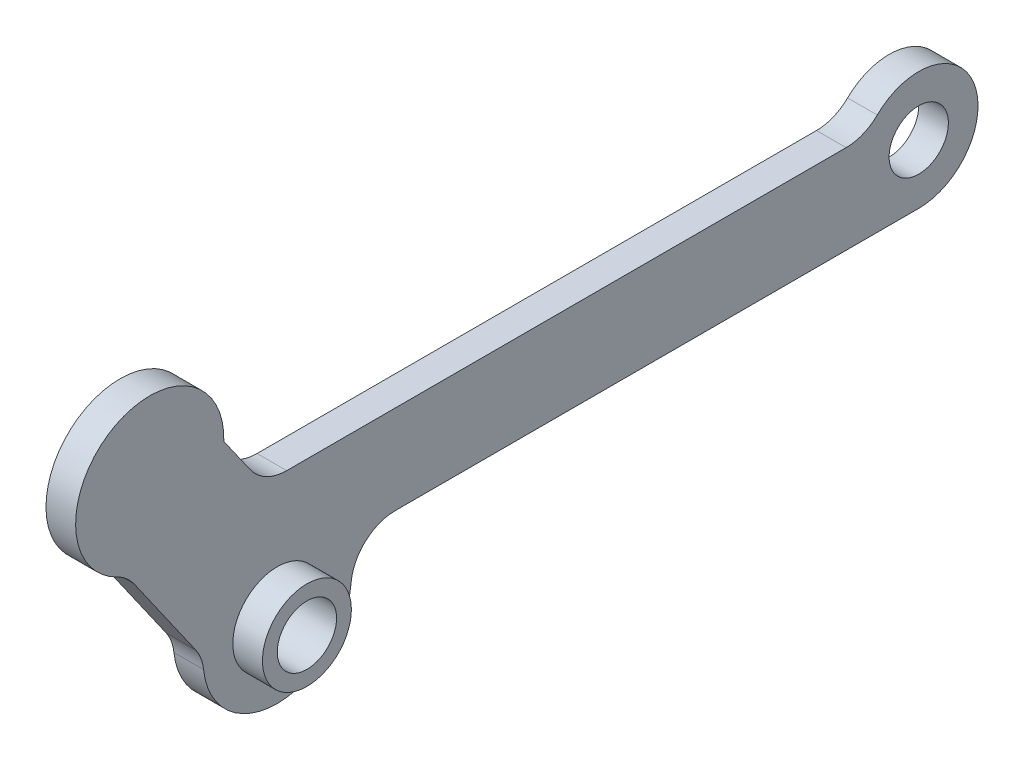
ISO-10303-21;
HEADER;
FILE_DESCRIPTION(('STEP AP214'),'2;1');
FILE_NAME('part.step','',(''),(''),'','','');
FILE_SCHEMA(('AUTOMOTIVE_DESIGN { 1 0 10303 214 1 1 1 1 }'));
ENDSEC;
DATA;
#1=APPLICATION_CONTEXT('core data for automotive mechanical design processes');
#2=APPLICATION_PROTOCOL_DEFINITION('international standard','automotive_design',2000,#1);
#3=PRODUCT_CONTEXT('',#1,'mechanical');
#4=PRODUCT('Part','Part','',(#3));
#5=PRODUCT_RELATED_PRODUCT_CATEGORY('part','',(#4));
#6=PRODUCT_DEFINITION_FORMATION('','',#4);
#7=PRODUCT_DEFINITION_CONTEXT('part definition',#1,'design');
#8=PRODUCT_DEFINITION('design','',#6,#7);
#9=PRODUCT_DEFINITION_SHAPE('','',#8);
#10=(LENGTH_UNIT() NAMED_UNIT(*) SI_UNIT(.MILLI.,.METRE.));
#11=(NAMED_UNIT(*) PLANE_ANGLE_UNIT() SI_UNIT($,.RADIAN.));
#12=(NAMED_UNIT(*) SI_UNIT($,.STERADIAN.) SOLID_ANGLE_UNIT());
#13=UNCERTAINTY_MEASURE_WITH_UNIT(LENGTH_MEASURE(1.E-05),#10,'distance_accuracy_value','');
#14=(GEOMETRIC_REPRESENTATION_CONTEXT(3) GLOBAL_UNCERTAINTY_ASSIGNED_CONTEXT((#13)) GLOBAL_UNIT_ASSIGNED_CONTEXT((#10,
#11,#12)) REPRESENTATION_CONTEXT('',''));
#15=CARTESIAN_POINT('',(0.,0.,0.));
#16=DIRECTION('',(0.,0.,1.));
#17=DIRECTION('',(1.,0.,0.));
#18=AXIS2_PLACEMENT_3D('',#15,#16,#17);
#19=CARTESIAN_POINT('',(2.,0.,0.));
#20=DIRECTION('',(0.,1.,0.));
#21=DIRECTION('',(0.,0.,1.));
#22=AXIS2_PLACEMENT_3D('',#19,#20,#21);
#23=PLANE('',#22);
#24=DIRECTION('',(0.,0.,-1.));
#25=VECTOR('',#24,1.);
#26=CARTESIAN_POINT('',(2.,0.,0.));
#27=LINE('',#26,#25);
#28=CARTESIAN_POINT('',(2.,0.,-1.56170115165524));
#29=VERTEX_POINT('',#28);
#30=CARTESIAN_POINT('',(2.,0.,-39.3022657436919));
#31=VERTEX_POINT('',#30);
#32=EDGE_CURVE('E239',#29,#31,#27,.T.);
#33=ORIENTED_EDGE('',*,*,#32,.T.);
#34=DIRECTION('',(-1.,0.,0.));
#35=VECTOR('',#34,1.);
#36=CARTESIAN_POINT('',(2.,0.,-39.3022657436919));
#37=LINE('',#36,#35);
#38=CARTESIAN_POINT('',(0.,0.,-39.3022657436919));
#39=VERTEX_POINT('',#38);
#40=EDGE_CURVE('E273',#31,#39,#37,.T.);
#41=ORIENTED_EDGE('',*,*,#40,.T.);
#42=DIRECTION('',(0.,0.,-1.));
#43=VECTOR('',#42,1.);
#44=CARTESIAN_POINT('',(0.,0.,0.));
#45=LINE('',#44,#43);
#46=CARTESIAN_POINT('',(0.,0.,-1.56170115165524));
#47=VERTEX_POINT('',#46);
#48=EDGE_CURVE('E265',#47,#39,#45,.T.);
#49=ORIENTED_EDGE('',*,*,#48,.F.);
#50=DIRECTION('',(-1.,0.,0.));
#51=VECTOR('',#50,1.);
#52=CARTESIAN_POINT('',(2.,0.,-1.56170115165524));
#53=LINE('',#52,#51);
#54=EDGE_CURVE('E248',#47,#29,#53,.F.);
#55=ORIENTED_EDGE('',*,*,#54,.T.);
#56=EDGE_LOOP('',(#33,#41,#49,#55));
#57=FACE_BOUND('',#56,.T.);
#58=ADVANCED_FACE('F136',(#57),#23,.T.);
#59=CARTESIAN_POINT('',(2.,-6.,0.));
#60=DIRECTION('',(0.,1.,0.));
#61=DIRECTION('',(0.,0.,1.));
#62=AXIS2_PLACEMENT_3D('',#59,#60,#61);
#63=PLANE('',#62);
#64=DIRECTION('',(0.,0.,-1.));
#65=VECTOR('',#64,1.);
#66=CARTESIAN_POINT('',(2.,-6.,0.));
#67=LINE('',#66,#65);
#68=CARTESIAN_POINT('',(2.,-6.,-8.89345099264765));
#69=VERTEX_POINT('',#68);
#70=CARTESIAN_POINT('',(2.,-6.,-44.2012452292583));
#71=VERTEX_POINT('',#70);
#72=EDGE_CURVE('E226',#69,#71,#67,.T.);
#73=ORIENTED_EDGE('',*,*,#72,.F.);
#74=DIRECTION('',(1.,0.,0.));
#75=VECTOR('',#74,1.);
#76=CARTESIAN_POINT('',(0.,-6.,-8.89345099264765));
#77=LINE('',#76,#75);
#78=CARTESIAN_POINT('',(0.,-6.,-8.89345099264765));
#79=VERTEX_POINT('',#78);
#80=EDGE_CURVE('E289',#69,#79,#77,.F.);
#81=ORIENTED_EDGE('',*,*,#80,.T.);
#82=DIRECTION('',(0.,0.,-1.));
#83=VECTOR('',#82,1.);
#84=CARTESIAN_POINT('',(0.,-6.,0.));
#85=LINE('',#84,#83);
#86=CARTESIAN_POINT('',(0.,-6.,-44.2012452292583));
#87=VERTEX_POINT('',#86);
#88=EDGE_CURVE('E244',#79,#87,#85,.T.);
#89=ORIENTED_EDGE('',*,*,#88,.T.);
#90=DIRECTION('',(-1.,0.,0.));
#91=VECTOR('',#90,1.);
#92=CARTESIAN_POINT('',(2.,-6.,-44.2012452292583));
#93=LINE('',#92,#91);
#94=EDGE_CURVE('E238',#71,#87,#93,.T.);
#95=ORIENTED_EDGE('',*,*,#94,.F.);
#96=EDGE_LOOP('',(#73,#81,#89,#95));
#97=FACE_BOUND('',#96,.T.);
#98=ADVANCED_FACE('F242',(#97),#63,.F.);
#99=CARTESIAN_POINT('',(0.,0.,0.));
#100=DIRECTION('',(1.,0.,0.));
#101=DIRECTION('',(0.,0.,-1.));
#102=AXIS2_PLACEMENT_3D('',#99,#100,#101);
#103=PLANE('',#102);
#104=CARTESIAN_POINT('',(0.,3.99297491893065,7.67900949316339));
#105=DIRECTION('',(1.,0.,0.));
#106=DIRECTION('',(0.,0.,-1.));
#107=AXIS2_PLACEMENT_3D('',#104,#105,#106);
#108=CIRCLE('',#107,1.8);
#109=CARTESIAN_POINT('',(0.,3.99297491893065,5.87900949316339));
#110=VERTEX_POINT('',#109);
#111=EDGE_CURVE('E12',#110,#110,#108,.F.);
#112=ORIENTED_EDGE('',*,*,#111,.F.);
#113=EDGE_LOOP('',(#112));
#114=FACE_BOUND('',#113,.T.);
#115=CARTESIAN_POINT('',(0.,-8.29430574540418,-0.924637052102279));
#116=DIRECTION('',(1.,0.,0.));
#117=DIRECTION('',(0.,0.,-1.));
#118=AXIS2_PLACEMENT_3D('',#115,#116,#117);
#119=CIRCLE('',#118,2.);
#120=CARTESIAN_POINT('',(0.,-8.29430574540418,-2.92463705210228));
#121=VERTEX_POINT('',#120);
#122=EDGE_CURVE('E271',#121,#121,#119,.F.);
#123=ORIENTED_EDGE('',*,*,#122,.F.);
#124=EDGE_LOOP('',(#123));
#125=FACE_BOUND('',#124,.T.);
#126=CARTESIAN_POINT('',(0.,-2.,-44.2012452292583));
#127=DIRECTION('',(1.,0.,0.));
#128=DIRECTION('',(0.,0.,-1.));
#129=AXIS2_PLACEMENT_3D('',#126,#127,#128);
#130=CIRCLE('',#129,2.);
#131=CARTESIAN_POINT('',(0.,-2.,-46.2012452292583));
#132=VERTEX_POINT('',#131);
#133=EDGE_CURVE('E270',#132,#132,#130,.F.);
#134=ORIENTED_EDGE('',*,*,#133,.F.);
#135=EDGE_LOOP('',(#134));
#136=FACE_BOUND('',#135,.T.);
#137=DIRECTION('',(0.,-0.819152044288992,-0.573576436351045));
#138=VECTOR('',#137,1.);
#139=CARTESIAN_POINT('',(0.,6.28728066433489,4.40240131600742));
#140=LINE('',#139,#138);
#141=CARTESIAN_POINT('',(0.,3.82982453146792,2.6816720069543));
#142=VERTEX_POINT('',#141);
#143=CARTESIAN_POINT('',(0.,1.27927069094687,0.895754981211733));
#144=VERTEX_POINT('',#143);
#145=EDGE_CURVE('E315',#142,#144,#140,.T.);
#146=ORIENTED_EDGE('',*,*,#145,.T.);
#147=CARTESIAN_POINT('',(0.,3.,-1.56170115165524));
#148=DIRECTION('',(1.,0.,0.));
#149=DIRECTION('',(0.,0.,-1.));
#150=AXIS2_PLACEMENT_3D('',#147,#148,#149);
#151=CIRCLE('',#150,3.);
#152=EDGE_CURVE('E151',#144,#47,#151,.T.);
#153=ORIENTED_EDGE('',*,*,#152,.T.);
#154=ORIENTED_EDGE('',*,*,#48,.T.);
#155=CARTESIAN_POINT('',(0.,3.,-39.3022657436919));
#156=DIRECTION('',(1.,0.,0.));
#157=DIRECTION('',(0.,0.,-1.));
#158=AXIS2_PLACEMENT_3D('',#155,#156,#157);
#159=CIRCLE('',#158,3.);
#160=CARTESIAN_POINT('',(0.,0.857142857142855,-41.4018283803632));
#161=VERTEX_POINT('',#160);
#162=EDGE_CURVE('E293',#39,#161,#159,.T.);
#163=ORIENTED_EDGE('',*,*,#162,.T.);
#164=CARTESIAN_POINT('',(0.,-2.,-44.2012452292583));
#165=DIRECTION('',(1.,0.,0.));
#166=DIRECTION('',(0.,0.,-1.));
#167=AXIS2_PLACEMENT_3D('',#164,#165,#166);
#168=CIRCLE('',#167,3.99999999999999);
#169=EDGE_CURVE('E254',#87,#161,#168,.T.);
#170=ORIENTED_EDGE('',*,*,#169,.F.);
#171=ORIENTED_EDGE('',*,*,#88,.F.);
#172=CARTESIAN_POINT('',(0.,-9.,-8.89345099264765));
#173=DIRECTION('',(1.,0.,0.));
#174=DIRECTION('',(0.,0.,-1.));
#175=AXIS2_PLACEMENT_3D('',#172,#173,#174);
#176=CIRCLE('',#175,3.);
#177=CARTESIAN_POINT('',(0.,-8.73536465452657,-5.90514576494314));
#178=VERTEX_POINT('',#177);
#179=EDGE_CURVE('E305',#79,#178,#176,.T.);
#180=ORIENTED_EDGE('',*,*,#179,.T.);
#181=CARTESIAN_POINT('',(0.,-8.29430574540418,-0.924637052102279));
#182=DIRECTION('',(1.,0.,0.));
#183=DIRECTION('',(0.,0.,-1.));
#184=AXIS2_PLACEMENT_3D('',#181,#182,#183);
#185=CIRCLE('',#184,4.99999999999999);
#186=CARTESIAN_POINT('',(0.,-8.82085126347562,4.04756063276493));
#187=VERTEX_POINT('',#186);
#188=EDGE_CURVE('E253',#187,#178,#185,.T.);
#189=ORIENTED_EDGE('',*,*,#188,.F.);
#190=CARTESIAN_POINT('',(0.,-9.13677857431849,7.03087924368525));
#191=DIRECTION('',(1.,0.,0.));
#192=DIRECTION('',(0.,0.,-1.));
#193=AXIS2_PLACEMENT_3D('',#190,#191,#192);
#194=CIRCLE('',#193,3.);
#195=CARTESIAN_POINT('',(0.,-7.41604926526535,4.57342311081828));
#196=VERTEX_POINT('',#195);
#197=EDGE_CURVE('E297',#187,#196,#194,.T.);
#198=ORIENTED_EDGE('',*,*,#197,.T.);
#199=DIRECTION('',(0.,-0.819152044288993,-0.573576436351045));
#200=VECTOR('',#199,1.);
#201=CARTESIAN_POINT('',(0.,1.69866917352653,10.9556176703194));
#202=LINE('',#201,#200);
#203=CARTESIAN_POINT('',(0.,-1.47389305201649,8.73416568455478));
#204=VERTEX_POINT('',#203);
#205=EDGE_CURVE('E326',#204,#196,#202,.T.);
#206=ORIENTED_EDGE('',*,*,#205,.F.);
#207=CARTESIAN_POINT('',(0.,-3.19462236106962,11.1916218174218));
#208=DIRECTION('',(1.,0.,0.));
#209=DIRECTION('',(0.,0.,-1.));
#210=AXIS2_PLACEMENT_3D('',#207,#208,#209);
#211=CIRCLE('',#210,3.);
#212=CARTESIAN_POINT('',(0.,-0.499273381069496,9.87439219582487));
#213=VERTEX_POINT('',#212);
#214=EDGE_CURVE('E301',#204,#213,#211,.T.);
#215=ORIENTED_EDGE('',*,*,#214,.T.);
#216=CARTESIAN_POINT('',(0.,3.99297491893071,7.67900949316339));
#217=DIRECTION('',(1.,0.,0.));
#218=DIRECTION('',(0.,0.,-1.));
#219=AXIS2_PLACEMENT_3D('',#216,#217,#218);
#220=CIRCLE('',#219,4.99999999999999);
#221=EDGE_CURVE('E329',#142,#213,#220,.T.);
#222=ORIENTED_EDGE('',*,*,#221,.F.);
#223=EDGE_LOOP('',(#146,#153,#154,#163,#170,#171,#180,#189,#198,#206,#215,#222));
#224=FACE_BOUND('',#223,.T.);
#225=ADVANCED_FACE('F312',(#114,#125,#136,#224),#103,.F.);
#226=CARTESIAN_POINT('',(2.,0.,0.));
#227=DIRECTION('',(1.,0.,0.));
#228=DIRECTION('',(0.,0.,-1.));
#229=AXIS2_PLACEMENT_3D('',#226,#227,#228);
#230=PLANE('',#229);
#231=CARTESIAN_POINT('',(2.,-2.,-44.2012452292583));
#232=DIRECTION('',(1.,0.,0.));
#233=DIRECTION('',(0.,0.,-1.));
#234=AXIS2_PLACEMENT_3D('',#231,#232,#233);
#235=CIRCLE('',#234,2.);
#236=CARTESIAN_POINT('',(2.,-2.,-46.2012452292583));
#237=VERTEX_POINT('',#236);
#238=EDGE_CURVE('E267',#237,#237,#235,.F.);
#239=ORIENTED_EDGE('',*,*,#238,.T.);
#240=EDGE_LOOP('',(#239));
#241=FACE_BOUND('',#240,.T.);
#242=CARTESIAN_POINT('',(2.,-8.29430574540418,-0.924637052102279));
#243=DIRECTION('',(1.,0.,0.));
#244=DIRECTION('',(0.,0.,-1.));
#245=AXIS2_PLACEMENT_3D('',#242,#243,#244);
#246=CIRCLE('',#245,3.);
#247=CARTESIAN_POINT('',(2.,-8.29430574540418,-3.92463705210228));
#248=VERTEX_POINT('',#247);
#249=EDGE_CURVE('E503',#248,#248,#246,.T.);
#250=ORIENTED_EDGE('',*,*,#249,.F.);
#251=EDGE_LOOP('',(#250));
#252=FACE_BOUND('',#251,.T.);
#253=CARTESIAN_POINT('',(2.,-8.29430574540418,-0.924637052102279));
#254=DIRECTION('',(1.,0.,0.));
#255=DIRECTION('',(0.,0.,-1.));
#256=AXIS2_PLACEMENT_3D('',#253,#254,#255);
#257=CIRCLE('',#256,4.99999999999999);
#258=CARTESIAN_POINT('',(2.,-8.82085126347562,4.04756063276493));
#259=VERTEX_POINT('',#258);
#260=CARTESIAN_POINT('',(2.,-8.73536465452657,-5.90514576494314));
#261=VERTEX_POINT('',#260);
#262=EDGE_CURVE('E257',#259,#261,#257,.T.);
#263=ORIENTED_EDGE('',*,*,#262,.T.);
#264=CARTESIAN_POINT('',(2.,-9.,-8.89345099264765));
#265=DIRECTION('',(1.,0.,0.));
#266=DIRECTION('',(0.,0.,-1.));
#267=AXIS2_PLACEMENT_3D('',#264,#265,#266);
#268=CIRCLE('',#267,3.);
#269=EDGE_CURVE('E234',#261,#69,#268,.F.);
#270=ORIENTED_EDGE('',*,*,#269,.T.);
#271=ORIENTED_EDGE('',*,*,#72,.T.);
#272=CARTESIAN_POINT('',(2.,-2.,-44.2012452292583));
#273=DIRECTION('',(1.,0.,0.));
#274=DIRECTION('',(0.,0.,-1.));
#275=AXIS2_PLACEMENT_3D('',#272,#273,#274);
#276=CIRCLE('',#275,3.99999999999999);
#277=CARTESIAN_POINT('',(2.,0.857142857142855,-41.4018283803632));
#278=VERTEX_POINT('',#277);
#279=EDGE_CURVE('E231',#71,#278,#276,.T.);
#280=ORIENTED_EDGE('',*,*,#279,.T.);
#281=CARTESIAN_POINT('',(2.,3.,-39.3022657436919));
#282=DIRECTION('',(1.,0.,0.));
#283=DIRECTION('',(0.,0.,-1.));
#284=AXIS2_PLACEMENT_3D('',#281,#282,#283);
#285=CIRCLE('',#284,3.);
#286=EDGE_CURVE('E295',#278,#31,#285,.F.);
#287=ORIENTED_EDGE('',*,*,#286,.T.);
#288=ORIENTED_EDGE('',*,*,#32,.F.);
#289=CARTESIAN_POINT('',(2.,3.,-1.56170115165524));
#290=DIRECTION('',(1.,0.,0.));
#291=DIRECTION('',(0.,0.,-1.));
#292=AXIS2_PLACEMENT_3D('',#289,#290,#291);
#293=CIRCLE('',#292,3.);
#294=CARTESIAN_POINT('',(2.,1.27927069094687,0.895754981211733));
#295=VERTEX_POINT('',#294);
#296=EDGE_CURVE('E144',#29,#295,#293,.F.);
#297=ORIENTED_EDGE('',*,*,#296,.T.);
#298=DIRECTION('',(0.,-0.819152044288992,-0.573576436351045));
#299=VECTOR('',#298,1.);
#300=CARTESIAN_POINT('',(2.,6.28728066433489,4.40240131600742));
#301=LINE('',#300,#299);
#302=CARTESIAN_POINT('',(2.,3.82982453146792,2.6816720069543));
#303=VERTEX_POINT('',#302);
#304=EDGE_CURVE('E322',#303,#295,#301,.T.);
#305=ORIENTED_EDGE('',*,*,#304,.F.);
#306=CARTESIAN_POINT('',(2.,3.99297491893071,7.67900949316339));
#307=DIRECTION('',(1.,0.,0.));
#308=DIRECTION('',(0.,0.,-1.));
#309=AXIS2_PLACEMENT_3D('',#306,#307,#308);
#310=CIRCLE('',#309,4.99999999999999);
#311=CARTESIAN_POINT('',(2.,-0.499273381069496,9.87439219582487));
#312=VERTEX_POINT('',#311);
#313=EDGE_CURVE('E266',#303,#312,#310,.T.);
#314=ORIENTED_EDGE('',*,*,#313,.T.);
#315=CARTESIAN_POINT('',(2.,-3.19462236106962,11.1916218174218));
#316=DIRECTION('',(1.,0.,0.));
#317=DIRECTION('',(0.,0.,-1.));
#318=AXIS2_PLACEMENT_3D('',#315,#316,#317);
#319=CIRCLE('',#318,3.);
#320=CARTESIAN_POINT('',(2.,-1.47389305201649,8.73416568455478));
#321=VERTEX_POINT('',#320);
#322=EDGE_CURVE('E303',#312,#321,#319,.F.);
#323=ORIENTED_EDGE('',*,*,#322,.T.);
#324=DIRECTION('',(0.,-0.819152044288993,-0.573576436351045));
#325=VECTOR('',#324,1.);
#326=CARTESIAN_POINT('',(2.,1.69866917352653,10.9556176703194));
#327=LINE('',#326,#325);
#328=CARTESIAN_POINT('',(2.,-7.41604926526535,4.57342311081828));
#329=VERTEX_POINT('',#328);
#330=EDGE_CURVE('E325',#321,#329,#327,.T.);
#331=ORIENTED_EDGE('',*,*,#330,.T.);
#332=CARTESIAN_POINT('',(2.,-9.13677857431849,7.03087924368525));
#333=DIRECTION('',(1.,0.,0.));
#334=DIRECTION('',(0.,0.,-1.));
#335=AXIS2_PLACEMENT_3D('',#332,#333,#334);
#336=CIRCLE('',#335,3.);
#337=EDGE_CURVE('E299',#329,#259,#336,.F.);
#338=ORIENTED_EDGE('',*,*,#337,.T.);
#339=EDGE_LOOP('',(#263,#270,#271,#280,#287,#288,#297,#305,#314,#323,#331,#338));
#340=FACE_BOUND('',#339,.T.);
#341=ADVANCED_FACE('F229',(#241,#252,#340),#230,.T.);
#342=CARTESIAN_POINT('',(2.,-2.,-44.2012452292583));
#343=DIRECTION('',(-1.,0.,0.));
#344=DIRECTION('',(0.,0.,1.));
#345=AXIS2_PLACEMENT_3D('',#342,#343,#344);
#346=CYLINDRICAL_SURFACE('',#345,3.99999999999999);
#347=ORIENTED_EDGE('',*,*,#169,.T.);
#348=DIRECTION('',(-1.,0.,0.));
#349=VECTOR('',#348,1.);
#350=CARTESIAN_POINT('',(2.,0.857142857142855,-41.4018283803632));
#351=LINE('',#350,#349);
#352=EDGE_CURVE('E252',#161,#278,#351,.F.);
#353=ORIENTED_EDGE('',*,*,#352,.T.);
#354=ORIENTED_EDGE('',*,*,#279,.F.);
#355=ORIENTED_EDGE('',*,*,#94,.T.);
#356=EDGE_LOOP('',(#347,#353,#354,#355));
#357=FACE_BOUND('',#356,.T.);
#358=ADVANCED_FACE('F250',(#357),#346,.T.);
#359=CARTESIAN_POINT('',(2.,3.99297491893071,7.67900949316339));
#360=DIRECTION('',(-1.,0.,0.));
#361=DIRECTION('',(0.,0.,1.));
#362=AXIS2_PLACEMENT_3D('',#359,#360,#361);
#363=CYLINDRICAL_SURFACE('',#362,4.99999999999999);
#364=ORIENTED_EDGE('',*,*,#221,.T.);
#365=DIRECTION('',(-1.,0.,0.));
#366=VECTOR('',#365,1.);
#367=CARTESIAN_POINT('',(2.,-0.499273381069497,9.87439219582487));
#368=LINE('',#367,#366);
#369=EDGE_CURVE('E287',#213,#312,#368,.F.);
#370=ORIENTED_EDGE('',*,*,#369,.T.);
#371=ORIENTED_EDGE('',*,*,#313,.F.);
#372=DIRECTION('',(-1.,0.,0.));
#373=VECTOR('',#372,1.);
#374=CARTESIAN_POINT('',(2.,3.82982453146792,2.6816720069543));
#375=LINE('',#374,#373);
#376=EDGE_CURVE('E263',#303,#142,#375,.T.);
#377=ORIENTED_EDGE('',*,*,#376,.T.);
#378=EDGE_LOOP('',(#364,#370,#371,#377));
#379=FACE_BOUND('',#378,.T.);
#380=ADVANCED_FACE('F350',(#379),#363,.T.);
#381=CARTESIAN_POINT('',(2.,6.28728066433489,4.40240131600742));
#382=DIRECTION('',(0.,0.573576436351045,-0.819152044288992));
#383=DIRECTION('',(0.,0.819152044288993,0.573576436351045));
#384=AXIS2_PLACEMENT_3D('',#381,#382,#383);
#385=PLANE('',#384);
#386=ORIENTED_EDGE('',*,*,#304,.T.);
#387=DIRECTION('',(-1.,0.,0.));
#388=VECTOR('',#387,1.);
#389=CARTESIAN_POINT('',(0.,1.27927069094686,0.895754981211733));
#390=LINE('',#389,#388);
#391=EDGE_CURVE('E291',#295,#144,#390,.T.);
#392=ORIENTED_EDGE('',*,*,#391,.T.);
#393=ORIENTED_EDGE('',*,*,#145,.F.);
#394=ORIENTED_EDGE('',*,*,#376,.F.);
#395=EDGE_LOOP('',(#386,#392,#393,#394));
#396=FACE_BOUND('',#395,.T.);
#397=ADVANCED_FACE('F321',(#396),#385,.T.);
#398=CARTESIAN_POINT('',(2.,1.69866917352653,10.9556176703194));
#399=DIRECTION('',(0.,0.573576436351045,-0.819152044288993));
#400=DIRECTION('',(0.,0.819152044288993,0.573576436351045));
#401=AXIS2_PLACEMENT_3D('',#398,#399,#400);
#402=PLANE('',#401);
#403=ORIENTED_EDGE('',*,*,#205,.T.);
#404=DIRECTION('',(1.,0.,0.));
#405=VECTOR('',#404,1.);
#406=CARTESIAN_POINT('',(2.,-7.41604926526535,4.57342311081828));
#407=LINE('',#406,#405);
#408=EDGE_CURVE('E285',#196,#329,#407,.T.);
#409=ORIENTED_EDGE('',*,*,#408,.T.);
#410=ORIENTED_EDGE('',*,*,#330,.F.);
#411=DIRECTION('',(1.,0.,0.));
#412=VECTOR('',#411,1.);
#413=CARTESIAN_POINT('',(0.,-1.47389305201649,8.73416568455478));
#414=LINE('',#413,#412);
#415=EDGE_CURVE('E282',#321,#204,#414,.F.);
#416=ORIENTED_EDGE('',*,*,#415,.T.);
#417=EDGE_LOOP('',(#403,#409,#410,#416));
#418=FACE_BOUND('',#417,.T.);
#419=ADVANCED_FACE('F356',(#418),#402,.F.);
#420=CARTESIAN_POINT('',(2.,-8.29430574540418,-0.924637052102279));
#421=DIRECTION('',(-1.,0.,0.));
#422=DIRECTION('',(0.,0.,1.));
#423=AXIS2_PLACEMENT_3D('',#420,#421,#422);
#424=CYLINDRICAL_SURFACE('',#423,4.99999999999999);
#425=ORIENTED_EDGE('',*,*,#262,.F.);
#426=DIRECTION('',(-1.,0.,0.));
#427=VECTOR('',#426,1.);
#428=CARTESIAN_POINT('',(2.,-8.82085126347562,4.04756063276493));
#429=LINE('',#428,#427);
#430=EDGE_CURVE('E279',#259,#187,#429,.T.);
#431=ORIENTED_EDGE('',*,*,#430,.T.);
#432=ORIENTED_EDGE('',*,*,#188,.T.);
#433=DIRECTION('',(-1.,0.,0.));
#434=VECTOR('',#433,1.);
#435=CARTESIAN_POINT('',(2.,-8.73536465452657,-5.90514576494314));
#436=LINE('',#435,#434);
#437=EDGE_CURVE('E277',#178,#261,#436,.F.);
#438=ORIENTED_EDGE('',*,*,#437,.T.);
#439=EDGE_LOOP('',(#425,#431,#432,#438));
#440=FACE_BOUND('',#439,.T.);
#441=ADVANCED_FACE('F361',(#440),#424,.T.);
#442=CARTESIAN_POINT('',(4.,-8.29430574540418,-0.924637052102279));
#443=DIRECTION('',(-1.,0.,0.));
#444=DIRECTION('',(0.,0.,1.));
#445=AXIS2_PLACEMENT_3D('',#442,#443,#444);
#446=CYLINDRICAL_SURFACE('',#445,3.);
#447=CARTESIAN_POINT('',(4.,-8.29430574540418,-0.924637052102279));
#448=DIRECTION('',(1.,0.,0.));
#449=DIRECTION('',(0.,0.,-1.));
#450=AXIS2_PLACEMENT_3D('',#447,#448,#449);
#451=CIRCLE('',#450,3.);
#452=CARTESIAN_POINT('',(4.,-8.29430574540418,-3.92463705210228));
#453=VERTEX_POINT('',#452);
#454=EDGE_CURVE('E259',#453,#453,#451,.T.);
#455=ORIENTED_EDGE('',*,*,#454,.F.);
#456=EDGE_LOOP('',(#455));
#457=FACE_BOUND('',#456,.T.);
#458=ORIENTED_EDGE('',*,*,#249,.T.);
#459=EDGE_LOOP('',(#458));
#460=FACE_BOUND('',#459,.T.);
#461=ADVANCED_FACE('F363',(#457,#460),#446,.T.);
#462=CARTESIAN_POINT('',(4.,-8.29430574540418,-0.924637052102279));
#463=DIRECTION('',(1.,0.,0.));
#464=DIRECTION('',(0.,0.,-1.));
#465=AXIS2_PLACEMENT_3D('',#462,#463,#464);
#466=PLANE('',#465);
#467=CARTESIAN_POINT('',(4.,-8.29430574540418,-0.924637052102279));
#468=DIRECTION('',(1.,0.,0.));
#469=DIRECTION('',(0.,0.,-1.));
#470=AXIS2_PLACEMENT_3D('',#467,#468,#469);
#471=CIRCLE('',#470,2.);
#472=CARTESIAN_POINT('',(4.,-8.29430574540418,-2.92463705210228));
#473=VERTEX_POINT('',#472);
#474=EDGE_CURVE('E500',#473,#473,#471,.T.);
#475=ORIENTED_EDGE('',*,*,#474,.F.);
#476=EDGE_LOOP('',(#475));
#477=FACE_BOUND('',#476,.T.);
#478=ORIENTED_EDGE('',*,*,#454,.T.);
#479=EDGE_LOOP('',(#478));
#480=FACE_BOUND('',#479,.T.);
#481=ADVANCED_FACE('F369',(#477,#480),#466,.T.);
#482=CARTESIAN_POINT('',(4.,-8.29430574540418,-0.924637052102279));
#483=DIRECTION('',(-1.,0.,0.));
#484=DIRECTION('',(0.,0.,1.));
#485=AXIS2_PLACEMENT_3D('',#482,#483,#484);
#486=CYLINDRICAL_SURFACE('',#485,2.);
#487=ORIENTED_EDGE('',*,*,#474,.T.);
#488=EDGE_LOOP('',(#487));
#489=FACE_BOUND('',#488,.T.);
#490=ORIENTED_EDGE('',*,*,#122,.T.);
#491=EDGE_LOOP('',(#490));
#492=FACE_BOUND('',#491,.T.);
#493=ADVANCED_FACE('F487',(#489,#492),#486,.F.);
#494=CARTESIAN_POINT('',(4.,-2.,-44.2012452292583));
#495=DIRECTION('',(-1.,0.,0.));
#496=DIRECTION('',(0.,0.,1.));
#497=AXIS2_PLACEMENT_3D('',#494,#495,#496);
#498=CYLINDRICAL_SURFACE('',#497,2.);
#499=ORIENTED_EDGE('',*,*,#238,.F.);
#500=EDGE_LOOP('',(#499));
#501=FACE_BOUND('',#500,.T.);
#502=ORIENTED_EDGE('',*,*,#133,.T.);
#503=EDGE_LOOP('',(#502));
#504=FACE_BOUND('',#503,.T.);
#505=ADVANCED_FACE('F409',(#501,#504),#498,.F.);
#506=CARTESIAN_POINT('',(2.,3.,-39.3022657436919));
#507=DIRECTION('',(-1.,0.,0.));
#508=DIRECTION('',(0.,0.,1.));
#509=AXIS2_PLACEMENT_3D('',#506,#507,#508);
#510=CYLINDRICAL_SURFACE('',#509,3.);
#511=ORIENTED_EDGE('',*,*,#286,.F.);
#512=ORIENTED_EDGE('',*,*,#352,.F.);
#513=ORIENTED_EDGE('',*,*,#162,.F.);
#514=ORIENTED_EDGE('',*,*,#40,.F.);
#515=EDGE_LOOP('',(#511,#512,#513,#514));
#516=FACE_BOUND('',#515,.T.);
#517=ADVANCED_FACE('F404',(#516),#510,.F.);
#518=CARTESIAN_POINT('',(2.,-9.13677857431849,7.03087924368525));
#519=DIRECTION('',(-1.,0.,0.));
#520=DIRECTION('',(0.,0.,1.));
#521=AXIS2_PLACEMENT_3D('',#518,#519,#520);
#522=CYLINDRICAL_SURFACE('',#521,3.);
#523=ORIENTED_EDGE('',*,*,#337,.F.);
#524=ORIENTED_EDGE('',*,*,#408,.F.);
#525=ORIENTED_EDGE('',*,*,#197,.F.);
#526=ORIENTED_EDGE('',*,*,#430,.F.);
#527=EDGE_LOOP('',(#523,#524,#525,#526));
#528=FACE_BOUND('',#527,.T.);
#529=ADVANCED_FACE('F360',(#528),#522,.F.);
#530=CARTESIAN_POINT('',(2.,-3.19462236106962,11.1916218174218));
#531=DIRECTION('',(-1.,0.,0.));
#532=DIRECTION('',(0.,0.,1.));
#533=AXIS2_PLACEMENT_3D('',#530,#531,#532);
#534=CYLINDRICAL_SURFACE('',#533,3.);
#535=ORIENTED_EDGE('',*,*,#322,.F.);
#536=ORIENTED_EDGE('',*,*,#369,.F.);
#537=ORIENTED_EDGE('',*,*,#214,.F.);
#538=ORIENTED_EDGE('',*,*,#415,.F.);
#539=EDGE_LOOP('',(#535,#536,#537,#538));
#540=FACE_BOUND('',#539,.T.);
#541=ADVANCED_FACE('F352',(#540),#534,.F.);
#542=CARTESIAN_POINT('',(2.,-9.,-8.89345099264765));
#543=DIRECTION('',(-1.,0.,0.));
#544=DIRECTION('',(0.,0.,1.));
#545=AXIS2_PLACEMENT_3D('',#542,#543,#544);
#546=CYLINDRICAL_SURFACE('',#545,3.);
#547=ORIENTED_EDGE('',*,*,#269,.F.);
#548=ORIENTED_EDGE('',*,*,#437,.F.);
#549=ORIENTED_EDGE('',*,*,#179,.F.);
#550=ORIENTED_EDGE('',*,*,#80,.F.);
#551=EDGE_LOOP('',(#547,#548,#549,#550));
#552=FACE_BOUND('',#551,.T.);
#553=ADVANCED_FACE('F342',(#552),#546,.F.);
#554=CARTESIAN_POINT('',(2.,3.,-1.56170115165524));
#555=DIRECTION('',(1.,0.,0.));
#556=DIRECTION('',(0.,0.,-1.));
#557=AXIS2_PLACEMENT_3D('',#554,#555,#556);
#558=CYLINDRICAL_SURFACE('',#557,3.);
#559=ORIENTED_EDGE('',*,*,#296,.F.);
#560=ORIENTED_EDGE('',*,*,#54,.F.);
#561=ORIENTED_EDGE('',*,*,#152,.F.);
#562=ORIENTED_EDGE('',*,*,#391,.F.);
#563=EDGE_LOOP('',(#559,#560,#561,#562));
#564=FACE_BOUND('',#563,.T.);
#565=ADVANCED_FACE('F138',(#564),#558,.F.);
#566=CARTESIAN_POINT('',(-2.,3.99297491893065,7.67900949316339));
#567=DIRECTION('',(1.,0.,0.));
#568=DIRECTION('',(0.,0.,-1.));
#569=AXIS2_PLACEMENT_3D('',#566,#567,#568);
#570=CYLINDRICAL_SURFACE('',#569,1.8);
#571=CARTESIAN_POINT('',(-2.,3.99297491893065,7.67900949316339));
#572=DIRECTION('',(-1.,0.,0.));
#573=DIRECTION('',(0.,0.,0.999999999999996));
#574=AXIS2_PLACEMENT_3D('',#571,#572,#573);
#575=CIRCLE('',#574,1.8);
#576=CARTESIAN_POINT('',(-2.,3.99297491893065,9.47900949316338));
#577=VERTEX_POINT('',#576);
#578=EDGE_CURVE('E513',#577,#577,#575,.T.);
#579=ORIENTED_EDGE('',*,*,#578,.F.);
#580=EDGE_LOOP('',(#579));
#581=FACE_BOUND('',#580,.T.);
#582=ORIENTED_EDGE('',*,*,#111,.T.);
#583=EDGE_LOOP('',(#582));
#584=FACE_BOUND('',#583,.T.);
#585=ADVANCED_FACE('F444',(#581,#584),#570,.T.);
#586=CARTESIAN_POINT('',(-2.,0.,0.));
#587=DIRECTION('',(-1.,0.,0.));
#588=DIRECTION('',(0.,0.,0.999999999999996));
#589=AXIS2_PLACEMENT_3D('',#586,#587,#588);
#590=PLANE('',#589);
#591=ORIENTED_EDGE('',*,*,#578,.T.);
#592=EDGE_LOOP('',(#591));
#593=FACE_BOUND('',#592,.T.);
#594=ADVANCED_FACE('F471',(#593),#590,.T.);
#595=CLOSED_SHELL('',(#58,#98,#225,#341,#358,#380,#397,#419,#441,#461,#481,#493,#505,#517,#529,
#541,#553,#565,#585,#594));
#596=MANIFOLD_SOLID_BREP('B2',#595);
#597=ADVANCED_BREP_SHAPE_REPRESENTATION('',(#18,#596),#14);
#598=SHAPE_DEFINITION_REPRESENTATION(#9,#597);
ENDSEC;
END-ISO-10303-21;
